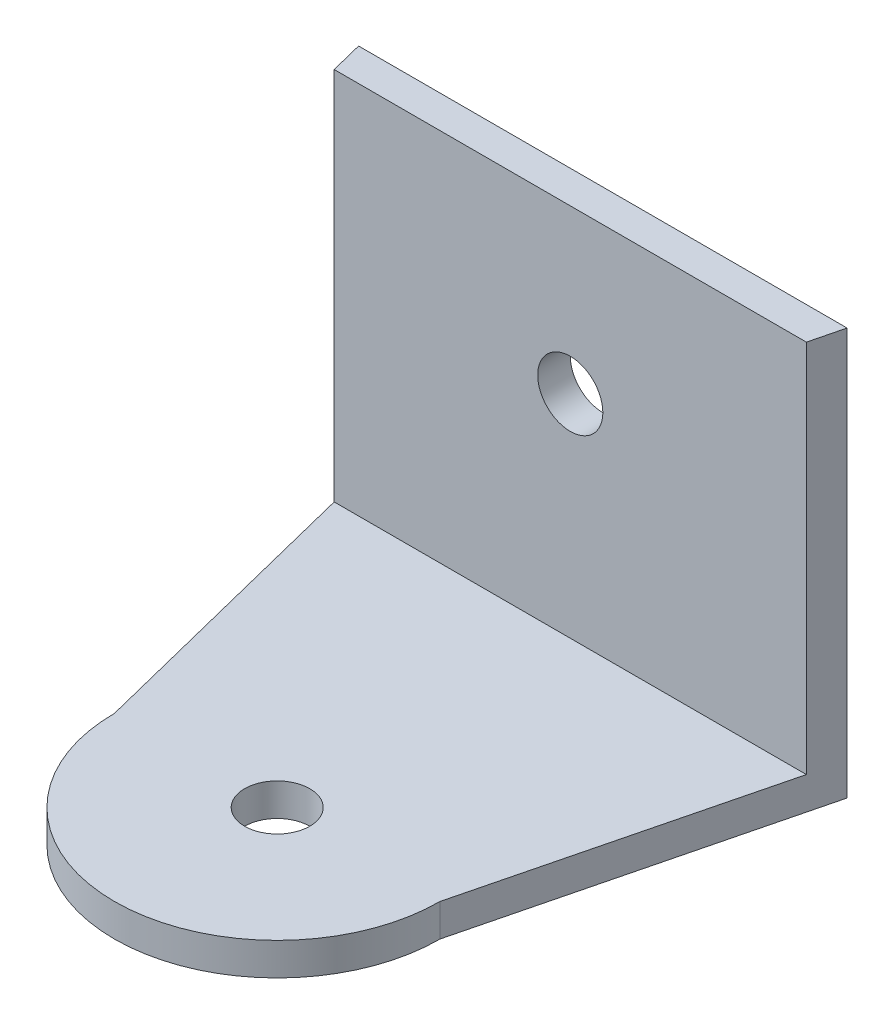
ISO-10303-21;
HEADER;
FILE_DESCRIPTION(('STEP AP214'),'2;1');
FILE_NAME('part.step','',(''),(''),'','','');
FILE_SCHEMA(('AUTOMOTIVE_DESIGN { 1 0 10303 214 1 1 1 1 }'));
ENDSEC;
DATA;
#1=APPLICATION_CONTEXT('core data for automotive mechanical design processes');
#2=APPLICATION_PROTOCOL_DEFINITION('international standard','automotive_design',2000,#1);
#3=PRODUCT_CONTEXT('',#1,'mechanical');
#4=PRODUCT('Part','Part','',(#3));
#5=PRODUCT_RELATED_PRODUCT_CATEGORY('part','',(#4));
#6=PRODUCT_DEFINITION_FORMATION('','',#4);
#7=PRODUCT_DEFINITION_CONTEXT('part definition',#1,'design');
#8=PRODUCT_DEFINITION('design','',#6,#7);
#9=PRODUCT_DEFINITION_SHAPE('','',#8);
#10=(LENGTH_UNIT() NAMED_UNIT(*) SI_UNIT(.MILLI.,.METRE.));
#11=(NAMED_UNIT(*) PLANE_ANGLE_UNIT() SI_UNIT($,.RADIAN.));
#12=(NAMED_UNIT(*) SI_UNIT($,.STERADIAN.) SOLID_ANGLE_UNIT());
#13=UNCERTAINTY_MEASURE_WITH_UNIT(LENGTH_MEASURE(1.E-05),#10,'distance_accuracy_value','');
#14=(GEOMETRIC_REPRESENTATION_CONTEXT(3) GLOBAL_UNCERTAINTY_ASSIGNED_CONTEXT((#13)) GLOBAL_UNIT_ASSIGNED_CONTEXT((#10,
#11,#12)) REPRESENTATION_CONTEXT('',''));
#15=CARTESIAN_POINT('',(0.,0.,0.));
#16=DIRECTION('',(0.,0.,1.));
#17=DIRECTION('',(1.,0.,0.));
#18=AXIS2_PLACEMENT_3D('',#15,#16,#17);
#19=CARTESIAN_POINT('',(-15.,-12.5,2.));
#20=DIRECTION('',(0.,1.,0.));
#21=DIRECTION('',(0.,0.,1.));
#22=AXIS2_PLACEMENT_3D('',#19,#20,#21);
#23=PLANE('',#22);
#24=CARTESIAN_POINT('',(0.,-12.5,20.));
#25=DIRECTION('',(0.,-1.,0.));
#26=DIRECTION('',(0.,0.,-1.));
#27=AXIS2_PLACEMENT_3D('',#24,#25,#26);
#28=CIRCLE('',#27,2.);
#29=CARTESIAN_POINT('',(0.,-12.5,18.));
#30=VERTEX_POINT('',#29);
#31=EDGE_CURVE('E177',#30,#30,#28,.T.);
#32=ORIENTED_EDGE('',*,*,#31,.F.);
#33=EDGE_LOOP('',(#32));
#34=FACE_BOUND('',#33,.T.);
#35=DIRECTION('',(-0.242535625036333,0.,0.970142500145332));
#36=VECTOR('',#35,1.);
#37=CARTESIAN_POINT('',(14.1176470588235,-12.5,3.52941176470588));
#38=LINE('',#37,#36);
#39=CARTESIAN_POINT('',(15.,-12.5,0.));
#40=VERTEX_POINT('',#39);
#41=CARTESIAN_POINT('',(10.,-12.5,20.));
#42=VERTEX_POINT('',#41);
#43=EDGE_CURVE('E149',#40,#42,#38,.T.);
#44=ORIENTED_EDGE('',*,*,#43,.T.);
#45=CARTESIAN_POINT('',(0.,-12.5,20.));
#46=DIRECTION('',(0.,-1.,0.));
#47=DIRECTION('',(0.,0.,-1.));
#48=AXIS2_PLACEMENT_3D('',#45,#46,#47);
#49=CIRCLE('',#48,10.);
#50=CARTESIAN_POINT('',(-10.,-12.5,20.));
#51=VERTEX_POINT('',#50);
#52=EDGE_CURVE('E206',#42,#51,#49,.T.);
#53=ORIENTED_EDGE('',*,*,#52,.T.);
#54=DIRECTION('',(0.242535625036333,0.,0.970142500145332));
#55=VECTOR('',#54,1.);
#56=CARTESIAN_POINT('',(-14.1176470588235,-12.5,3.52941176470588));
#57=LINE('',#56,#55);
#58=CARTESIAN_POINT('',(-15.,-12.5,0.));
#59=VERTEX_POINT('',#58);
#60=EDGE_CURVE('E203',#59,#51,#57,.T.);
#61=ORIENTED_EDGE('',*,*,#60,.F.);
#62=DIRECTION('',(1.,0.,0.));
#63=VECTOR('',#62,1.);
#64=CARTESIAN_POINT('',(-15.,-12.5,0.));
#65=LINE('',#64,#63);
#66=EDGE_CURVE('E166',#59,#40,#65,.T.);
#67=ORIENTED_EDGE('',*,*,#66,.T.);
#68=EDGE_LOOP('',(#44,#53,#61,#67));
#69=FACE_BOUND('',#68,.T.);
#70=ADVANCED_FACE('F88',(#34,#69),#23,.F.);
#71=CARTESIAN_POINT('',(-15.,-10.5,30.));
#72=DIRECTION('',(0.,-1.,0.));
#73=DIRECTION('',(0.,0.,-1.));
#74=AXIS2_PLACEMENT_3D('',#71,#72,#73);
#75=PLANE('',#74);
#76=CARTESIAN_POINT('',(0.,-10.5,20.));
#77=DIRECTION('',(0.,-1.,0.));
#78=DIRECTION('',(0.,0.,-1.));
#79=AXIS2_PLACEMENT_3D('',#76,#77,#78);
#80=CIRCLE('',#79,2.);
#81=CARTESIAN_POINT('',(0.,-10.5,18.));
#82=VERTEX_POINT('',#81);
#83=EDGE_CURVE('E170',#82,#82,#80,.T.);
#84=ORIENTED_EDGE('',*,*,#83,.T.);
#85=EDGE_LOOP('',(#84));
#86=FACE_BOUND('',#85,.T.);
#87=CARTESIAN_POINT('',(0.,-10.5,20.));
#88=DIRECTION('',(0.,-1.,0.));
#89=DIRECTION('',(0.,0.,-1.));
#90=AXIS2_PLACEMENT_3D('',#87,#88,#89);
#91=CIRCLE('',#90,10.);
#92=CARTESIAN_POINT('',(10.,-10.5,20.));
#93=VERTEX_POINT('',#92);
#94=CARTESIAN_POINT('',(-10.,-10.5,20.));
#95=VERTEX_POINT('',#94);
#96=EDGE_CURVE('E173',#93,#95,#91,.T.);
#97=ORIENTED_EDGE('',*,*,#96,.F.);
#98=DIRECTION('',(-0.242535625036333,0.,0.970142500145332));
#99=VECTOR('',#98,1.);
#100=CARTESIAN_POINT('',(6.1764705882353,-10.5,35.2941176470588));
#101=LINE('',#100,#99);
#102=CARTESIAN_POINT('',(14.5,-10.5,2.));
#103=VERTEX_POINT('',#102);
#104=EDGE_CURVE('E210',#103,#93,#101,.T.);
#105=ORIENTED_EDGE('',*,*,#104,.F.);
#106=DIRECTION('',(-1.,0.,0.));
#107=VECTOR('',#106,1.);
#108=CARTESIAN_POINT('',(-15.,-10.5,2.));
#109=LINE('',#108,#107);
#110=CARTESIAN_POINT('',(-14.5,-10.5,2.));
#111=VERTEX_POINT('',#110);
#112=EDGE_CURVE('E102',#103,#111,#109,.T.);
#113=ORIENTED_EDGE('',*,*,#112,.T.);
#114=DIRECTION('',(0.242535625036333,0.,0.970142500145332));
#115=VECTOR('',#114,1.);
#116=CARTESIAN_POINT('',(-7.94117647058824,-10.5,28.2352941176471));
#117=LINE('',#116,#115);
#118=EDGE_CURVE('E12',#111,#95,#117,.T.);
#119=ORIENTED_EDGE('',*,*,#118,.T.);
#120=EDGE_LOOP('',(#97,#105,#113,#119));
#121=FACE_BOUND('',#120,.T.);
#122=ADVANCED_FACE('F217',(#86,#121),#75,.F.);
#123=CARTESIAN_POINT('',(-15.,12.5,2.));
#124=DIRECTION('',(0.,-1.,0.));
#125=DIRECTION('',(0.,0.,-1.));
#126=AXIS2_PLACEMENT_3D('',#123,#124,#125);
#127=PLANE('',#126);
#128=DIRECTION('',(-0.242535625036333,0.,0.970142500145332));
#129=VECTOR('',#128,1.);
#130=CARTESIAN_POINT('',(14.1176470588235,12.5,3.52941176470588));
#131=LINE('',#130,#129);
#132=CARTESIAN_POINT('',(15.,12.5,0.));
#133=VERTEX_POINT('',#132);
#134=CARTESIAN_POINT('',(14.5,12.5,2.));
#135=VERTEX_POINT('',#134);
#136=EDGE_CURVE('E146',#133,#135,#131,.T.);
#137=ORIENTED_EDGE('',*,*,#136,.F.);
#138=DIRECTION('',(-1.,0.,0.));
#139=VECTOR('',#138,1.);
#140=CARTESIAN_POINT('',(-15.,12.5,0.));
#141=LINE('',#140,#139);
#142=CARTESIAN_POINT('',(-15.,12.5,0.));
#143=VERTEX_POINT('',#142);
#144=EDGE_CURVE('E154',#133,#143,#141,.T.);
#145=ORIENTED_EDGE('',*,*,#144,.T.);
#146=DIRECTION('',(0.242535625036333,0.,0.970142500145332));
#147=VECTOR('',#146,1.);
#148=CARTESIAN_POINT('',(-14.1176470588235,12.5,3.52941176470588));
#149=LINE('',#148,#147);
#150=CARTESIAN_POINT('',(-14.5,12.5,2.));
#151=VERTEX_POINT('',#150);
#152=EDGE_CURVE('E202',#143,#151,#149,.T.);
#153=ORIENTED_EDGE('',*,*,#152,.T.);
#154=DIRECTION('',(-1.,0.,0.));
#155=VECTOR('',#154,1.);
#156=CARTESIAN_POINT('',(-15.,12.5,2.));
#157=LINE('',#156,#155);
#158=EDGE_CURVE('E96',#135,#151,#157,.T.);
#159=ORIENTED_EDGE('',*,*,#158,.F.);
#160=EDGE_LOOP('',(#137,#145,#153,#159));
#161=FACE_BOUND('',#160,.T.);
#162=ADVANCED_FACE('F90',(#161),#127,.F.);
#163=CARTESIAN_POINT('',(0.,0.,2.));
#164=DIRECTION('',(0.,0.,1.));
#165=DIRECTION('',(1.,0.,0.));
#166=AXIS2_PLACEMENT_3D('',#163,#164,#165);
#167=PLANE('',#166);
#168=CARTESIAN_POINT('',(0.,2.5,2.));
#169=DIRECTION('',(0.,0.,1.));
#170=DIRECTION('',(1.,0.,0.));
#171=AXIS2_PLACEMENT_3D('',#168,#169,#170);
#172=CIRCLE('',#171,2.);
#173=CARTESIAN_POINT('',(2.,2.5,2.));
#174=VERTEX_POINT('',#173);
#175=EDGE_CURVE('E188',#174,#174,#172,.T.);
#176=ORIENTED_EDGE('',*,*,#175,.F.);
#177=EDGE_LOOP('',(#176));
#178=FACE_BOUND('',#177,.T.);
#179=ORIENTED_EDGE('',*,*,#112,.F.);
#180=DIRECTION('',(0.,1.,0.));
#181=VECTOR('',#180,1.);
#182=CARTESIAN_POINT('',(14.5,0.,2.));
#183=LINE('',#182,#181);
#184=EDGE_CURVE('E199',#103,#135,#183,.T.);
#185=ORIENTED_EDGE('',*,*,#184,.T.);
#186=ORIENTED_EDGE('',*,*,#158,.T.);
#187=DIRECTION('',(0.,1.,0.));
#188=VECTOR('',#187,1.);
#189=CARTESIAN_POINT('',(-14.5,0.,2.));
#190=LINE('',#189,#188);
#191=EDGE_CURVE('E172',#111,#151,#190,.T.);
#192=ORIENTED_EDGE('',*,*,#191,.F.);
#193=EDGE_LOOP('',(#179,#185,#186,#192));
#194=FACE_BOUND('',#193,.T.);
#195=ADVANCED_FACE('F196',(#178,#194),#167,.T.);
#196=CARTESIAN_POINT('',(0.,0.,0.));
#197=DIRECTION('',(0.,0.,1.));
#198=DIRECTION('',(1.,0.,0.));
#199=AXIS2_PLACEMENT_3D('',#196,#197,#198);
#200=PLANE('',#199);
#201=CARTESIAN_POINT('',(0.,2.5,0.));
#202=DIRECTION('',(0.,0.,1.));
#203=DIRECTION('',(1.,0.,0.));
#204=AXIS2_PLACEMENT_3D('',#201,#202,#203);
#205=CIRCLE('',#204,2.);
#206=CARTESIAN_POINT('',(2.,2.5,0.));
#207=VERTEX_POINT('',#206);
#208=EDGE_CURVE('E155',#207,#207,#205,.T.);
#209=ORIENTED_EDGE('',*,*,#208,.T.);
#210=EDGE_LOOP('',(#209));
#211=FACE_BOUND('',#210,.T.);
#212=DIRECTION('',(0.,1.,0.));
#213=VECTOR('',#212,1.);
#214=CARTESIAN_POINT('',(15.,12.5,0.));
#215=LINE('',#214,#213);
#216=EDGE_CURVE('E142',#40,#133,#215,.T.);
#217=ORIENTED_EDGE('',*,*,#216,.F.);
#218=ORIENTED_EDGE('',*,*,#66,.F.);
#219=DIRECTION('',(0.,-1.,0.));
#220=VECTOR('',#219,1.);
#221=CARTESIAN_POINT('',(-15.,12.5,0.));
#222=LINE('',#221,#220);
#223=EDGE_CURVE('E164',#143,#59,#222,.T.);
#224=ORIENTED_EDGE('',*,*,#223,.F.);
#225=ORIENTED_EDGE('',*,*,#144,.F.);
#226=EDGE_LOOP('',(#217,#218,#224,#225));
#227=FACE_BOUND('',#226,.T.);
#228=ADVANCED_FACE('F163',(#211,#227),#200,.F.);
#229=CARTESIAN_POINT('',(0.,2.5,0.));
#230=DIRECTION('',(0.,0.,1.));
#231=DIRECTION('',(1.,0.,0.));
#232=AXIS2_PLACEMENT_3D('',#229,#230,#231);
#233=CYLINDRICAL_SURFACE('',#232,2.);
#234=ORIENTED_EDGE('',*,*,#208,.F.);
#235=EDGE_LOOP('',(#234));
#236=FACE_BOUND('',#235,.T.);
#237=ORIENTED_EDGE('',*,*,#175,.T.);
#238=EDGE_LOOP('',(#237));
#239=FACE_BOUND('',#238,.T.);
#240=ADVANCED_FACE('F194',(#236,#239),#233,.F.);
#241=CARTESIAN_POINT('',(0.,12.5,20.));
#242=DIRECTION('',(0.,-1.,0.));
#243=DIRECTION('',(0.,0.,-1.));
#244=AXIS2_PLACEMENT_3D('',#241,#242,#243);
#245=CYLINDRICAL_SURFACE('',#244,10.);
#246=ORIENTED_EDGE('',*,*,#96,.T.);
#247=DIRECTION('',(0.,-1.,0.));
#248=VECTOR('',#247,1.);
#249=CARTESIAN_POINT('',(-10.,12.5,20.));
#250=LINE('',#249,#248);
#251=EDGE_CURVE('E183',#95,#51,#250,.T.);
#252=ORIENTED_EDGE('',*,*,#251,.T.);
#253=ORIENTED_EDGE('',*,*,#52,.F.);
#254=DIRECTION('',(0.,-1.,0.));
#255=VECTOR('',#254,1.);
#256=CARTESIAN_POINT('',(10.,12.5,20.));
#257=LINE('',#256,#255);
#258=EDGE_CURVE('E161',#93,#42,#257,.T.);
#259=ORIENTED_EDGE('',*,*,#258,.F.);
#260=EDGE_LOOP('',(#246,#252,#253,#259));
#261=FACE_BOUND('',#260,.T.);
#262=ADVANCED_FACE('F230',(#261),#245,.T.);
#263=CARTESIAN_POINT('',(-14.1176470588235,12.5,3.52941176470588));
#264=DIRECTION('',(0.970142500145332,0.,-0.242535625036333));
#265=DIRECTION('',(-0.242535625036333,0.,-0.970142500145332));
#266=AXIS2_PLACEMENT_3D('',#263,#264,#265);
#267=PLANE('',#266);
#268=ORIENTED_EDGE('',*,*,#191,.T.);
#269=ORIENTED_EDGE('',*,*,#152,.F.);
#270=ORIENTED_EDGE('',*,*,#223,.T.);
#271=ORIENTED_EDGE('',*,*,#60,.T.);
#272=ORIENTED_EDGE('',*,*,#251,.F.);
#273=ORIENTED_EDGE('',*,*,#118,.F.);
#274=EDGE_LOOP('',(#268,#269,#270,#271,#272,#273));
#275=FACE_BOUND('',#274,.T.);
#276=ADVANCED_FACE('F201',(#275),#267,.F.);
#277=CARTESIAN_POINT('',(0.,12.5,20.));
#278=DIRECTION('',(0.,-1.,0.));
#279=DIRECTION('',(0.,0.,-1.));
#280=AXIS2_PLACEMENT_3D('',#277,#278,#279);
#281=CYLINDRICAL_SURFACE('',#280,2.);
#282=ORIENTED_EDGE('',*,*,#31,.T.);
#283=EDGE_LOOP('',(#282));
#284=FACE_BOUND('',#283,.T.);
#285=ORIENTED_EDGE('',*,*,#83,.F.);
#286=EDGE_LOOP('',(#285));
#287=FACE_BOUND('',#286,.T.);
#288=ADVANCED_FACE('F227',(#284,#287),#281,.F.);
#289=CARTESIAN_POINT('',(14.1176470588235,12.5,3.52941176470588));
#290=DIRECTION('',(0.970142500145332,0.,0.242535625036333));
#291=DIRECTION('',(0.242535625036333,0.,-0.970142500145332));
#292=AXIS2_PLACEMENT_3D('',#289,#290,#291);
#293=PLANE('',#292);
#294=ORIENTED_EDGE('',*,*,#104,.T.);
#295=ORIENTED_EDGE('',*,*,#258,.T.);
#296=ORIENTED_EDGE('',*,*,#43,.F.);
#297=ORIENTED_EDGE('',*,*,#216,.T.);
#298=ORIENTED_EDGE('',*,*,#136,.T.);
#299=ORIENTED_EDGE('',*,*,#184,.F.);
#300=EDGE_LOOP('',(#294,#295,#296,#297,#298,#299));
#301=FACE_BOUND('',#300,.T.);
#302=ADVANCED_FACE('F145',(#301),#293,.T.);
#303=CLOSED_SHELL('',(#70,#122,#162,#195,#228,#240,#262,#276,#288,#302));
#304=MANIFOLD_SOLID_BREP('B2',#303);
#305=ADVANCED_BREP_SHAPE_REPRESENTATION('',(#18,#304),#14);
#306=SHAPE_DEFINITION_REPRESENTATION(#9,#305);
ENDSEC;
END-ISO-10303-21;
